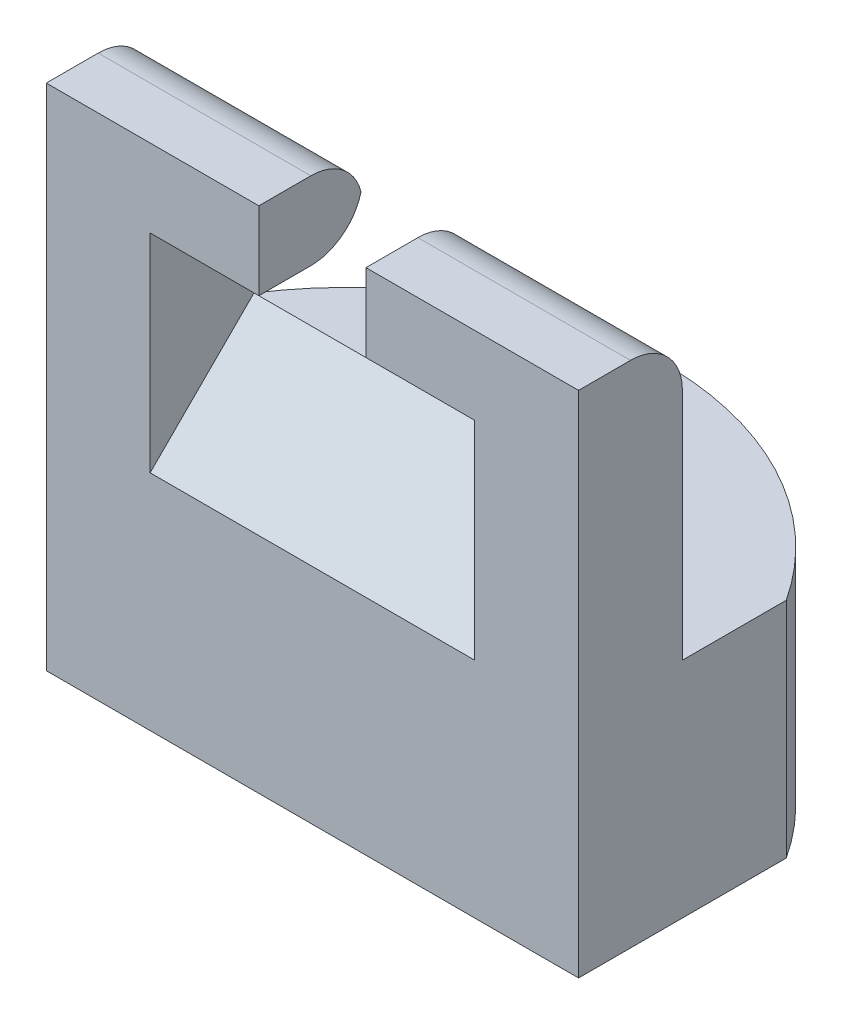
ISO-10303-21;
HEADER;
FILE_DESCRIPTION(('STEP AP214'),'2;1');
FILE_NAME('part.step','',(''),(''),'','','');
FILE_SCHEMA(('AUTOMOTIVE_DESIGN { 1 0 10303 214 1 1 1 1 }'));
ENDSEC;
DATA;
#1=APPLICATION_CONTEXT('core data for automotive mechanical design processes');
#2=APPLICATION_PROTOCOL_DEFINITION('international standard','automotive_design',2000,#1);
#3=PRODUCT_CONTEXT('',#1,'mechanical');
#4=PRODUCT('Part','Part','',(#3));
#5=PRODUCT_RELATED_PRODUCT_CATEGORY('part','',(#4));
#6=PRODUCT_DEFINITION_FORMATION('','',#4);
#7=PRODUCT_DEFINITION_CONTEXT('part definition',#1,'design');
#8=PRODUCT_DEFINITION('design','',#6,#7);
#9=PRODUCT_DEFINITION_SHAPE('','',#8);
#10=(LENGTH_UNIT() NAMED_UNIT(*) SI_UNIT(.MILLI.,.METRE.));
#11=(NAMED_UNIT(*) PLANE_ANGLE_UNIT() SI_UNIT($,.RADIAN.));
#12=(NAMED_UNIT(*) SI_UNIT($,.STERADIAN.) SOLID_ANGLE_UNIT());
#13=UNCERTAINTY_MEASURE_WITH_UNIT(LENGTH_MEASURE(1.E-05),#10,'distance_accuracy_value','');
#14=(GEOMETRIC_REPRESENTATION_CONTEXT(3) GLOBAL_UNCERTAINTY_ASSIGNED_CONTEXT((#13)) GLOBAL_UNIT_ASSIGNED_CONTEXT((#10,
#11,#12)) REPRESENTATION_CONTEXT('',''));
#15=CARTESIAN_POINT('',(0.,0.,0.));
#16=DIRECTION('',(0.,0.,1.));
#17=DIRECTION('',(1.,0.,0.));
#18=AXIS2_PLACEMENT_3D('',#15,#16,#17);
#19=CARTESIAN_POINT('',(0.,9.8,0.));
#20=DIRECTION('',(0.,1.,0.));
#21=DIRECTION('',(0.,0.,1.));
#22=AXIS2_PLACEMENT_3D('',#19,#20,#21);
#23=PLANE('',#22);
#24=DIRECTION('',(0.,0.,1.));
#25=VECTOR('',#24,1.);
#26=CARTESIAN_POINT('',(4.09375,9.8,-2.));
#27=LINE('',#26,#25);
#28=CARTESIAN_POINT('',(4.09375,9.8,-1.));
#29=VERTEX_POINT('',#28);
#30=CARTESIAN_POINT('',(4.09375,9.8,0.));
#31=VERTEX_POINT('',#30);
#32=EDGE_CURVE('E173',#29,#31,#27,.T.);
#33=ORIENTED_EDGE('',*,*,#32,.F.);
#34=DIRECTION('',(-1.,0.,0.));
#35=VECTOR('',#34,1.);
#36=CARTESIAN_POINT('',(0.,9.8,-1.));
#37=LINE('',#36,#35);
#38=CARTESIAN_POINT('',(0.,9.8,-1.));
#39=VERTEX_POINT('',#38);
#40=EDGE_CURVE('E272',#29,#39,#37,.T.);
#41=ORIENTED_EDGE('',*,*,#40,.T.);
#42=DIRECTION('',(0.,0.,1.));
#43=VECTOR('',#42,1.);
#44=CARTESIAN_POINT('',(0.,9.8,0.));
#45=LINE('',#44,#43);
#46=CARTESIAN_POINT('',(0.,9.8,0.));
#47=VERTEX_POINT('',#46);
#48=EDGE_CURVE('E208',#39,#47,#45,.T.);
#49=ORIENTED_EDGE('',*,*,#48,.T.);
#50=DIRECTION('',(1.,0.,0.));
#51=VECTOR('',#50,1.);
#52=CARTESIAN_POINT('',(0.,9.8,0.));
#53=LINE('',#52,#51);
#54=EDGE_CURVE('E211',#47,#31,#53,.T.);
#55=ORIENTED_EDGE('',*,*,#54,.T.);
#56=EDGE_LOOP('',(#33,#41,#49,#55));
#57=FACE_BOUND('',#56,.T.);
#58=ADVANCED_FACE('F41',(#57),#23,.T.);
#59=CARTESIAN_POINT('',(2.,8.3,-6.77089803375032));
#60=DIRECTION('',(0.,1.,0.));
#61=DIRECTION('',(0.,0.,1.));
#62=AXIS2_PLACEMENT_3D('',#59,#60,#61);
#63=PLANE('',#62);
#64=DIRECTION('',(-1.,0.,0.));
#65=VECTOR('',#64,1.);
#66=CARTESIAN_POINT('',(2.,8.3,-1.));
#67=LINE('',#66,#65);
#68=CARTESIAN_POINT('',(2.,8.3,-1.));
#69=VERTEX_POINT('',#68);
#70=CARTESIAN_POINT('',(4.09375,8.3,-1.));
#71=VERTEX_POINT('',#70);
#72=EDGE_CURVE('E187',#69,#71,#67,.F.);
#73=ORIENTED_EDGE('',*,*,#72,.T.);
#74=DIRECTION('',(0.,0.,-1.));
#75=VECTOR('',#74,1.);
#76=CARTESIAN_POINT('',(4.09375,8.3,-2.));
#77=LINE('',#76,#75);
#78=CARTESIAN_POINT('',(4.09375,8.3,0.));
#79=VERTEX_POINT('',#78);
#80=EDGE_CURVE('E170',#79,#71,#77,.T.);
#81=ORIENTED_EDGE('',*,*,#80,.F.);
#82=DIRECTION('',(-1.,0.,0.));
#83=VECTOR('',#82,1.);
#84=CARTESIAN_POINT('',(2.,8.3,0.));
#85=LINE('',#84,#83);
#86=CARTESIAN_POINT('',(2.,8.3,0.));
#87=VERTEX_POINT('',#86);
#88=EDGE_CURVE('E184',#79,#87,#85,.T.);
#89=ORIENTED_EDGE('',*,*,#88,.T.);
#90=DIRECTION('',(0.,0.,1.));
#91=VECTOR('',#90,1.);
#92=CARTESIAN_POINT('',(2.,8.3,-6.77089803375032));
#93=LINE('',#92,#91);
#94=EDGE_CURVE('E204',#69,#87,#93,.T.);
#95=ORIENTED_EDGE('',*,*,#94,.F.);
#96=EDGE_LOOP('',(#73,#81,#89,#95));
#97=FACE_BOUND('',#96,.T.);
#98=ADVANCED_FACE('F182',(#97),#63,.F.);
#99=CARTESIAN_POINT('',(0.,9.3,-1.));
#100=DIRECTION('',(-1.,0.,0.));
#101=DIRECTION('',(0.,0.,1.));
#102=AXIS2_PLACEMENT_3D('',#99,#100,#101);
#103=CYLINDRICAL_SURFACE('',#102,1.);
#104=CARTESIAN_POINT('',(2.,9.3,-1.));
#105=DIRECTION('',(-1.,0.,0.));
#106=DIRECTION('',(0.,-1.,0.));
#107=AXIS2_PLACEMENT_3D('',#104,#105,#106);
#108=CIRCLE('',#107,1.);
#109=CARTESIAN_POINT('',(2.,9.05,-1.96824583655186));
#110=VERTEX_POINT('',#109);
#111=EDGE_CURVE('E260',#110,#69,#108,.T.);
#112=ORIENTED_EDGE('',*,*,#111,.F.);
#113=DIRECTION('',(1.,0.,0.));
#114=VECTOR('',#113,1.);
#115=CARTESIAN_POINT('',(2.,9.05,-1.96824583655186));
#116=LINE('',#115,#114);
#117=CARTESIAN_POINT('',(4.09375,9.05,-1.96824583655186));
#118=VERTEX_POINT('',#117);
#119=EDGE_CURVE('E283',#110,#118,#116,.T.);
#120=ORIENTED_EDGE('',*,*,#119,.T.);
#121=CARTESIAN_POINT('',(4.09375,9.3,-1.));
#122=DIRECTION('',(-1.,0.,0.));
#123=DIRECTION('',(0.,0.,1.));
#124=AXIS2_PLACEMENT_3D('',#121,#122,#123);
#125=CIRCLE('',#124,1.);
#126=EDGE_CURVE('E188',#118,#71,#125,.T.);
#127=ORIENTED_EDGE('',*,*,#126,.T.);
#128=ORIENTED_EDGE('',*,*,#72,.F.);
#129=EDGE_LOOP('',(#112,#120,#127,#128));
#130=FACE_BOUND('',#129,.T.);
#131=ADVANCED_FACE('F344',(#130),#103,.T.);
#132=CARTESIAN_POINT('',(5.125,4.3,-0.645898033750316));
#133=DIRECTION('',(0.,-1.,0.));
#134=DIRECTION('',(0.,0.,-1.));
#135=AXIS2_PLACEMENT_3D('',#132,#133,#134);
#136=PLANE('',#135);
#137=DIRECTION('',(-1.,0.,0.));
#138=VECTOR('',#137,1.);
#139=CARTESIAN_POINT('',(0.,4.3,-2.));
#140=LINE('',#139,#138);
#141=CARTESIAN_POINT('',(10.25,4.3,-2.));
#142=VERTEX_POINT('',#141);
#143=CARTESIAN_POINT('',(0.,4.3,-2.));
#144=VERTEX_POINT('',#143);
#145=EDGE_CURVE('E206',#142,#144,#140,.T.);
#146=ORIENTED_EDGE('',*,*,#145,.F.);
#147=DIRECTION('',(0.,0.,-1.));
#148=VECTOR('',#147,1.);
#149=CARTESIAN_POINT('',(10.25,4.3,-4.));
#150=LINE('',#149,#148);
#151=CARTESIAN_POINT('',(10.25,4.3,-3.99999999999999));
#152=VERTEX_POINT('',#151);
#153=EDGE_CURVE('E223',#142,#152,#150,.T.);
#154=ORIENTED_EDGE('',*,*,#153,.T.);
#155=CARTESIAN_POINT('',(5.125,4.3,-0.645898033750316));
#156=DIRECTION('',(0.,1.,0.));
#157=DIRECTION('',(0.,0.,-1.));
#158=AXIS2_PLACEMENT_3D('',#155,#156,#157);
#159=CIRCLE('',#158,6.125);
#160=CARTESIAN_POINT('',(0.,4.3,-4.));
#161=VERTEX_POINT('',#160);
#162=EDGE_CURVE('E225',#152,#161,#159,.T.);
#163=ORIENTED_EDGE('',*,*,#162,.T.);
#164=DIRECTION('',(0.,0.,1.));
#165=VECTOR('',#164,1.);
#166=CARTESIAN_POINT('',(0.,4.3,-4.));
#167=LINE('',#166,#165);
#168=EDGE_CURVE('E228',#161,#144,#167,.T.);
#169=ORIENTED_EDGE('',*,*,#168,.T.);
#170=EDGE_LOOP('',(#146,#154,#163,#169));
#171=FACE_BOUND('',#170,.T.);
#172=ADVANCED_FACE('F476',(#171),#136,.F.);
#173=CARTESIAN_POINT('',(0.,4.3,0.));
#174=DIRECTION('',(0.,0.,-1.));
#175=DIRECTION('',(-1.,0.,0.));
#176=AXIS2_PLACEMENT_3D('',#173,#174,#175);
#177=PLANE('',#176);
#178=DIRECTION('',(0.,1.,0.));
#179=VECTOR('',#178,1.);
#180=CARTESIAN_POINT('',(8.25000000000001,8.3,0.));
#181=LINE('',#180,#179);
#182=CARTESIAN_POINT('',(8.25000000000001,4.29999999999999,0.));
#183=VERTEX_POINT('',#182);
#184=CARTESIAN_POINT('',(8.25000000000001,8.3,0.));
#185=VERTEX_POINT('',#184);
#186=EDGE_CURVE('E196',#183,#185,#181,.T.);
#187=ORIENTED_EDGE('',*,*,#186,.F.);
#188=DIRECTION('',(-1.,0.,0.));
#189=VECTOR('',#188,1.);
#190=CARTESIAN_POINT('',(0.,4.29999999999999,0.));
#191=LINE('',#190,#189);
#192=CARTESIAN_POINT('',(2.,4.29999999999999,0.));
#193=VERTEX_POINT('',#192);
#194=EDGE_CURVE('E264',#183,#193,#191,.T.);
#195=ORIENTED_EDGE('',*,*,#194,.T.);
#196=DIRECTION('',(0.,-1.,0.));
#197=VECTOR('',#196,1.);
#198=CARTESIAN_POINT('',(2.,8.3,0.));
#199=LINE('',#198,#197);
#200=EDGE_CURVE('E194',#87,#193,#199,.T.);
#201=ORIENTED_EDGE('',*,*,#200,.F.);
#202=ORIENTED_EDGE('',*,*,#88,.F.);
#203=DIRECTION('',(0.,1.,0.));
#204=VECTOR('',#203,1.);
#205=CARTESIAN_POINT('',(4.09375,-0.000999999999999265,0.));
#206=LINE('',#205,#204);
#207=EDGE_CURVE('E166',#79,#31,#206,.T.);
#208=ORIENTED_EDGE('',*,*,#207,.T.);
#209=ORIENTED_EDGE('',*,*,#54,.F.);
#210=DIRECTION('',(0.,-1.,0.));
#211=VECTOR('',#210,1.);
#212=CARTESIAN_POINT('',(0.,4.3,0.));
#213=LINE('',#212,#211);
#214=CARTESIAN_POINT('',(0.,0.,0.));
#215=VERTEX_POINT('',#214);
#216=EDGE_CURVE('E231',#47,#215,#213,.T.);
#217=ORIENTED_EDGE('',*,*,#216,.T.);
#218=DIRECTION('',(1.,0.,0.));
#219=VECTOR('',#218,1.);
#220=CARTESIAN_POINT('',(0.,0.,0.));
#221=LINE('',#220,#219);
#222=CARTESIAN_POINT('',(10.25,0.,0.));
#223=VERTEX_POINT('',#222);
#224=EDGE_CURVE('E222',#215,#223,#221,.T.);
#225=ORIENTED_EDGE('',*,*,#224,.T.);
#226=DIRECTION('',(0.,-1.,0.));
#227=VECTOR('',#226,1.);
#228=CARTESIAN_POINT('',(10.25,4.3,0.));
#229=LINE('',#228,#227);
#230=CARTESIAN_POINT('',(10.25,9.8,0.));
#231=VERTEX_POINT('',#230);
#232=EDGE_CURVE('E247',#231,#223,#229,.T.);
#233=ORIENTED_EDGE('',*,*,#232,.F.);
#234=CARTESIAN_POINT('',(6.15625,9.8,0.));
#235=VERTEX_POINT('',#234);
#236=EDGE_CURVE('E210',#235,#231,#53,.T.);
#237=ORIENTED_EDGE('',*,*,#236,.F.);
#238=DIRECTION('',(0.,1.,0.));
#239=VECTOR('',#238,1.);
#240=CARTESIAN_POINT('',(6.15625,-0.000999999999999265,0.));
#241=LINE('',#240,#239);
#242=CARTESIAN_POINT('',(6.15625,8.3,0.));
#243=VERTEX_POINT('',#242);
#244=EDGE_CURVE('E178',#243,#235,#241,.T.);
#245=ORIENTED_EDGE('',*,*,#244,.F.);
#246=EDGE_CURVE('E195',#185,#243,#85,.T.);
#247=ORIENTED_EDGE('',*,*,#246,.F.);
#248=EDGE_LOOP('',(#187,#195,#201,#202,#208,#209,#217,#225,#233,#237,#245,#247));
#249=FACE_BOUND('',#248,.T.);
#250=ADVANCED_FACE('F192',(#249),#177,.F.);
#251=CARTESIAN_POINT('',(10.25,4.3,-4.));
#252=DIRECTION('',(-1.,0.,0.));
#253=DIRECTION('',(0.,0.,1.));
#254=AXIS2_PLACEMENT_3D('',#251,#252,#253);
#255=PLANE('',#254);
#256=DIRECTION('',(0.,-1.,0.));
#257=VECTOR('',#256,1.);
#258=CARTESIAN_POINT('',(10.25,9.8,-2.));
#259=LINE('',#258,#257);
#260=CARTESIAN_POINT('',(10.25,8.8,-2.));
#261=VERTEX_POINT('',#260);
#262=EDGE_CURVE('E216',#261,#142,#259,.T.);
#263=ORIENTED_EDGE('',*,*,#262,.F.);
#264=CARTESIAN_POINT('',(10.25,8.8,-1.));
#265=DIRECTION('',(-1.,0.,0.));
#266=DIRECTION('',(0.,0.,1.));
#267=AXIS2_PLACEMENT_3D('',#264,#265,#266);
#268=CIRCLE('',#267,1.);
#269=CARTESIAN_POINT('',(10.25,9.8,-1.));
#270=VERTEX_POINT('',#269);
#271=EDGE_CURVE('E11',#261,#270,#268,.F.);
#272=ORIENTED_EDGE('',*,*,#271,.T.);
#273=DIRECTION('',(0.,0.,-1.));
#274=VECTOR('',#273,1.);
#275=CARTESIAN_POINT('',(10.25,9.8,0.));
#276=LINE('',#275,#274);
#277=EDGE_CURVE('E213',#231,#270,#276,.T.);
#278=ORIENTED_EDGE('',*,*,#277,.F.);
#279=ORIENTED_EDGE('',*,*,#232,.T.);
#280=DIRECTION('',(0.,0.,-1.));
#281=VECTOR('',#280,1.);
#282=CARTESIAN_POINT('',(10.25,0.,-4.));
#283=LINE('',#282,#281);
#284=CARTESIAN_POINT('',(10.25,0.,-3.99999999999999));
#285=VERTEX_POINT('',#284);
#286=EDGE_CURVE('E234',#223,#285,#283,.T.);
#287=ORIENTED_EDGE('',*,*,#286,.T.);
#288=DIRECTION('',(0.,-1.,0.));
#289=VECTOR('',#288,1.);
#290=CARTESIAN_POINT('',(10.25,4.3,-3.99999999999999));
#291=LINE('',#290,#289);
#292=EDGE_CURVE('E244',#152,#285,#291,.T.);
#293=ORIENTED_EDGE('',*,*,#292,.F.);
#294=ORIENTED_EDGE('',*,*,#153,.F.);
#295=EDGE_LOOP('',(#263,#272,#278,#279,#287,#293,#294));
#296=FACE_BOUND('',#295,.T.);
#297=ADVANCED_FACE('F307',(#296),#255,.F.);
#298=CARTESIAN_POINT('',(5.125,4.3,-0.645898033750316));
#299=DIRECTION('',(0.,-1.,0.));
#300=DIRECTION('',(0.,0.,-1.));
#301=AXIS2_PLACEMENT_3D('',#298,#299,#300);
#302=CYLINDRICAL_SURFACE('',#301,6.125);
#303=CARTESIAN_POINT('',(5.125,0.,-0.645898033750316));
#304=DIRECTION('',(0.,1.,0.));
#305=DIRECTION('',(0.,0.,-1.));
#306=AXIS2_PLACEMENT_3D('',#303,#304,#305);
#307=CIRCLE('',#306,6.125);
#308=CARTESIAN_POINT('',(0.,0.,-4.));
#309=VERTEX_POINT('',#308);
#310=EDGE_CURVE('E236',#285,#309,#307,.T.);
#311=ORIENTED_EDGE('',*,*,#310,.T.);
#312=DIRECTION('',(0.,-1.,0.));
#313=VECTOR('',#312,1.);
#314=CARTESIAN_POINT('',(0.,4.3,-4.));
#315=LINE('',#314,#313);
#316=EDGE_CURVE('E241',#161,#309,#315,.T.);
#317=ORIENTED_EDGE('',*,*,#316,.F.);
#318=ORIENTED_EDGE('',*,*,#162,.F.);
#319=ORIENTED_EDGE('',*,*,#292,.T.);
#320=EDGE_LOOP('',(#311,#317,#318,#319));
#321=FACE_BOUND('',#320,.T.);
#322=ADVANCED_FACE('F321',(#321),#302,.T.);
#323=CARTESIAN_POINT('',(0.,4.3,-4.));
#324=DIRECTION('',(1.,0.,0.));
#325=DIRECTION('',(0.,0.,-1.));
#326=AXIS2_PLACEMENT_3D('',#323,#324,#325);
#327=PLANE('',#326);
#328=ORIENTED_EDGE('',*,*,#48,.F.);
#329=CARTESIAN_POINT('',(0.,8.8,-1.));
#330=DIRECTION('',(1.,0.,0.));
#331=DIRECTION('',(0.,0.,-1.));
#332=AXIS2_PLACEMENT_3D('',#329,#330,#331);
#333=CIRCLE('',#332,1.);
#334=CARTESIAN_POINT('',(0.,8.8,-2.));
#335=VERTEX_POINT('',#334);
#336=EDGE_CURVE('E275',#39,#335,#333,.F.);
#337=ORIENTED_EDGE('',*,*,#336,.T.);
#338=DIRECTION('',(0.,-1.,0.));
#339=VECTOR('',#338,1.);
#340=CARTESIAN_POINT('',(0.,9.8,-2.));
#341=LINE('',#340,#339);
#342=EDGE_CURVE('E220',#335,#144,#341,.T.);
#343=ORIENTED_EDGE('',*,*,#342,.T.);
#344=ORIENTED_EDGE('',*,*,#168,.F.);
#345=ORIENTED_EDGE('',*,*,#316,.T.);
#346=DIRECTION('',(0.,0.,1.));
#347=VECTOR('',#346,1.);
#348=CARTESIAN_POINT('',(0.,0.,-4.));
#349=LINE('',#348,#347);
#350=EDGE_CURVE('E226',#309,#215,#349,.T.);
#351=ORIENTED_EDGE('',*,*,#350,.T.);
#352=ORIENTED_EDGE('',*,*,#216,.F.);
#353=EDGE_LOOP('',(#328,#337,#343,#344,#345,#351,#352));
#354=FACE_BOUND('',#353,.T.);
#355=ADVANCED_FACE('F328',(#354),#327,.F.);
#356=CARTESIAN_POINT('',(5.125,0.,-0.645898033750316));
#357=DIRECTION('',(0.,-1.,0.));
#358=DIRECTION('',(0.,0.,-1.));
#359=AXIS2_PLACEMENT_3D('',#356,#357,#358);
#360=PLANE('',#359);
#361=CARTESIAN_POINT('',(5.125,0.,-4.));
#362=DIRECTION('',(0.,-1.,0.));
#363=DIRECTION('',(0.,0.,-1.));
#364=AXIS2_PLACEMENT_3D('',#361,#362,#363);
#365=CIRCLE('',#364,2.05);
#366=CARTESIAN_POINT('',(5.125,0.,-6.05));
#367=VERTEX_POINT('',#366);
#368=EDGE_CURVE('E365',#367,#367,#365,.T.);
#369=ORIENTED_EDGE('',*,*,#368,.F.);
#370=EDGE_LOOP('',(#369));
#371=FACE_BOUND('',#370,.T.);
#372=ORIENTED_EDGE('',*,*,#224,.F.);
#373=ORIENTED_EDGE('',*,*,#350,.F.);
#374=ORIENTED_EDGE('',*,*,#310,.F.);
#375=ORIENTED_EDGE('',*,*,#286,.F.);
#376=EDGE_LOOP('',(#372,#373,#374,#375));
#377=FACE_BOUND('',#376,.T.);
#378=ADVANCED_FACE('F324',(#371,#377),#360,.T.);
#379=CARTESIAN_POINT('',(0.,9.8,-2.));
#380=DIRECTION('',(0.,0.,1.));
#381=DIRECTION('',(1.,0.,0.));
#382=AXIS2_PLACEMENT_3D('',#379,#380,#381);
#383=PLANE('',#382);
#384=ORIENTED_EDGE('',*,*,#342,.F.);
#385=DIRECTION('',(-1.,0.,0.));
#386=VECTOR('',#385,1.);
#387=CARTESIAN_POINT('',(4.09375,8.8,-2.));
#388=LINE('',#387,#386);
#389=CARTESIAN_POINT('',(2.,8.8,-2.));
#390=VERTEX_POINT('',#389);
#391=EDGE_CURVE('E279',#335,#390,#388,.F.);
#392=ORIENTED_EDGE('',*,*,#391,.T.);
#393=DIRECTION('',(0.,-1.,0.));
#394=VECTOR('',#393,1.);
#395=CARTESIAN_POINT('',(2.,9.8,-2.));
#396=LINE('',#395,#394);
#397=CARTESIAN_POINT('',(2.,6.3,-2.));
#398=VERTEX_POINT('',#397);
#399=EDGE_CURVE('E256',#390,#398,#396,.T.);
#400=ORIENTED_EDGE('',*,*,#399,.T.);
#401=DIRECTION('',(1.,0.,0.));
#402=VECTOR('',#401,1.);
#403=CARTESIAN_POINT('',(0.,6.3,-2.));
#404=LINE('',#403,#402);
#405=CARTESIAN_POINT('',(8.25000000000001,6.3,-2.));
#406=VERTEX_POINT('',#405);
#407=EDGE_CURVE('E250',#398,#406,#404,.T.);
#408=ORIENTED_EDGE('',*,*,#407,.T.);
#409=DIRECTION('',(0.,1.,0.));
#410=VECTOR('',#409,1.);
#411=CARTESIAN_POINT('',(8.25000000000001,9.8,-2.));
#412=LINE('',#411,#410);
#413=CARTESIAN_POINT('',(8.25000000000001,8.8,-2.));
#414=VERTEX_POINT('',#413);
#415=EDGE_CURVE('E253',#406,#414,#412,.T.);
#416=ORIENTED_EDGE('',*,*,#415,.T.);
#417=DIRECTION('',(-1.,0.,0.));
#418=VECTOR('',#417,1.);
#419=CARTESIAN_POINT('',(10.25,8.8,-2.));
#420=LINE('',#419,#418);
#421=EDGE_CURVE('E277',#414,#261,#420,.F.);
#422=ORIENTED_EDGE('',*,*,#421,.T.);
#423=ORIENTED_EDGE('',*,*,#262,.T.);
#424=ORIENTED_EDGE('',*,*,#145,.T.);
#425=EDGE_LOOP('',(#384,#392,#400,#408,#416,#422,#423,#424));
#426=FACE_BOUND('',#425,.T.);
#427=ADVANCED_FACE('F300',(#426),#383,.F.);
#428=ORIENTED_EDGE('',*,*,#277,.T.);
#429=DIRECTION('',(-1.,0.,0.));
#430=VECTOR('',#429,1.);
#431=CARTESIAN_POINT('',(6.15625,9.8,-1.));
#432=LINE('',#431,#430);
#433=CARTESIAN_POINT('',(6.15625,9.8,-1.));
#434=VERTEX_POINT('',#433);
#435=EDGE_CURVE('E287',#270,#434,#432,.T.);
#436=ORIENTED_EDGE('',*,*,#435,.T.);
#437=DIRECTION('',(0.,0.,-1.));
#438=VECTOR('',#437,1.);
#439=CARTESIAN_POINT('',(6.15625,9.8,-2.));
#440=LINE('',#439,#438);
#441=EDGE_CURVE('E179',#235,#434,#440,.T.);
#442=ORIENTED_EDGE('',*,*,#441,.F.);
#443=ORIENTED_EDGE('',*,*,#236,.T.);
#444=EDGE_LOOP('',(#428,#436,#442,#443));
#445=FACE_BOUND('',#444,.T.);
#446=ADVANCED_FACE('F310',(#445),#23,.T.);
#447=CARTESIAN_POINT('',(2.,8.3,-6.77089803375032));
#448=DIRECTION('',(-1.,0.,0.));
#449=DIRECTION('',(0.,-1.,0.));
#450=AXIS2_PLACEMENT_3D('',#447,#448,#449);
#451=PLANE('',#450);
#452=ORIENTED_EDGE('',*,*,#399,.F.);
#453=CARTESIAN_POINT('',(2.,8.8,-1.));
#454=DIRECTION('',(-1.,0.,0.));
#455=DIRECTION('',(0.,-1.,0.));
#456=AXIS2_PLACEMENT_3D('',#453,#454,#455);
#457=CIRCLE('',#456,1.);
#458=EDGE_CURVE('E281',#390,#110,#457,.F.);
#459=ORIENTED_EDGE('',*,*,#458,.T.);
#460=ORIENTED_EDGE('',*,*,#111,.T.);
#461=ORIENTED_EDGE('',*,*,#94,.T.);
#462=ORIENTED_EDGE('',*,*,#200,.T.);
#463=DIRECTION('',(0.,-0.707106781186549,0.707106781186546));
#464=VECTOR('',#463,1.);
#465=CARTESIAN_POINT('',(2.,9.68544901687516,-5.38544901687515));
#466=LINE('',#465,#464);
#467=EDGE_CURVE('E269',#193,#398,#466,.F.);
#468=ORIENTED_EDGE('',*,*,#467,.T.);
#469=EDGE_LOOP('',(#452,#459,#460,#461,#462,#468));
#470=FACE_BOUND('',#469,.T.);
#471=ADVANCED_FACE('F342',(#470),#451,.F.);
#472=ORIENTED_EDGE('',*,*,#246,.T.);
#473=DIRECTION('',(0.,0.,1.));
#474=VECTOR('',#473,1.);
#475=CARTESIAN_POINT('',(6.15625,8.3,-2.));
#476=LINE('',#475,#474);
#477=CARTESIAN_POINT('',(6.15625,8.3,-1.));
#478=VERTEX_POINT('',#477);
#479=EDGE_CURVE('E189',#478,#243,#476,.T.);
#480=ORIENTED_EDGE('',*,*,#479,.F.);
#481=CARTESIAN_POINT('',(8.25000000000001,8.3,-1.));
#482=VERTEX_POINT('',#481);
#483=EDGE_CURVE('E258',#478,#482,#67,.F.);
#484=ORIENTED_EDGE('',*,*,#483,.T.);
#485=DIRECTION('',(0.,0.,1.));
#486=VECTOR('',#485,1.);
#487=CARTESIAN_POINT('',(8.25000000000001,8.3,-6.77089803375032));
#488=LINE('',#487,#486);
#489=EDGE_CURVE('E199',#482,#185,#488,.T.);
#490=ORIENTED_EDGE('',*,*,#489,.T.);
#491=EDGE_LOOP('',(#472,#480,#484,#490));
#492=FACE_BOUND('',#491,.T.);
#493=ADVANCED_FACE('F359',(#492),#63,.F.);
#494=CARTESIAN_POINT('',(8.25000000000001,8.3,-6.77089803375032));
#495=DIRECTION('',(1.,0.,0.));
#496=DIRECTION('',(0.,0.,-1.));
#497=AXIS2_PLACEMENT_3D('',#494,#495,#496);
#498=PLANE('',#497);
#499=CARTESIAN_POINT('',(8.25000000000001,9.3,-1.));
#500=DIRECTION('',(1.,0.,0.));
#501=DIRECTION('',(0.,0.,-1.));
#502=AXIS2_PLACEMENT_3D('',#499,#500,#501);
#503=CIRCLE('',#502,1.);
#504=CARTESIAN_POINT('',(8.25000000000001,9.05,-1.96824583655186));
#505=VERTEX_POINT('',#504);
#506=EDGE_CURVE('E262',#482,#505,#503,.T.);
#507=ORIENTED_EDGE('',*,*,#506,.T.);
#508=CARTESIAN_POINT('',(8.25000000000001,8.8,-1.));
#509=DIRECTION('',(1.,0.,0.));
#510=DIRECTION('',(0.,0.,-1.));
#511=AXIS2_PLACEMENT_3D('',#508,#509,#510);
#512=CIRCLE('',#511,1.);
#513=EDGE_CURVE('E49',#505,#414,#512,.F.);
#514=ORIENTED_EDGE('',*,*,#513,.T.);
#515=ORIENTED_EDGE('',*,*,#415,.F.);
#516=DIRECTION('',(0.,0.707106781186549,-0.707106781186546));
#517=VECTOR('',#516,1.);
#518=CARTESIAN_POINT('',(8.25000000000001,9.68544901687516,-5.38544901687515));
#519=LINE('',#518,#517);
#520=EDGE_CURVE('E266',#406,#183,#519,.F.);
#521=ORIENTED_EDGE('',*,*,#520,.T.);
#522=ORIENTED_EDGE('',*,*,#186,.T.);
#523=ORIENTED_EDGE('',*,*,#489,.F.);
#524=EDGE_LOOP('',(#507,#514,#515,#521,#522,#523));
#525=FACE_BOUND('',#524,.T.);
#526=ADVANCED_FACE('F294',(#525),#498,.F.);
#527=CARTESIAN_POINT('',(6.15625,9.3,-1.));
#528=DIRECTION('',(1.,0.,0.));
#529=DIRECTION('',(0.,0.,-1.));
#530=AXIS2_PLACEMENT_3D('',#527,#528,#529);
#531=CIRCLE('',#530,1.);
#532=CARTESIAN_POINT('',(6.15625,9.05,-1.96824583655186));
#533=VERTEX_POINT('',#532);
#534=EDGE_CURVE('E350',#478,#533,#531,.T.);
#535=ORIENTED_EDGE('',*,*,#534,.T.);
#536=DIRECTION('',(1.,0.,0.));
#537=VECTOR('',#536,1.);
#538=CARTESIAN_POINT('',(6.15625,9.05,-1.96824583655186));
#539=LINE('',#538,#537);
#540=EDGE_CURVE('E56',#533,#505,#539,.T.);
#541=ORIENTED_EDGE('',*,*,#540,.T.);
#542=ORIENTED_EDGE('',*,*,#506,.F.);
#543=ORIENTED_EDGE('',*,*,#483,.F.);
#544=EDGE_LOOP('',(#535,#541,#542,#543));
#545=FACE_BOUND('',#544,.T.);
#546=ADVANCED_FACE('F361',(#545),#103,.T.);
#547=CARTESIAN_POINT('',(6.15625,-0.000999999999999265,-2.));
#548=DIRECTION('',(1.,0.,0.));
#549=DIRECTION('',(0.,0.,-1.));
#550=AXIS2_PLACEMENT_3D('',#547,#548,#549);
#551=PLANE('',#550);
#552=ORIENTED_EDGE('',*,*,#441,.T.);
#553=CARTESIAN_POINT('',(6.15625,8.8,-1.));
#554=DIRECTION('',(1.,0.,0.));
#555=DIRECTION('',(0.,0.,-1.));
#556=AXIS2_PLACEMENT_3D('',#553,#554,#555);
#557=CIRCLE('',#556,1.);
#558=EDGE_CURVE('E64',#434,#533,#557,.F.);
#559=ORIENTED_EDGE('',*,*,#558,.T.);
#560=ORIENTED_EDGE('',*,*,#534,.F.);
#561=ORIENTED_EDGE('',*,*,#479,.T.);
#562=ORIENTED_EDGE('',*,*,#244,.T.);
#563=EDGE_LOOP('',(#552,#559,#560,#561,#562));
#564=FACE_BOUND('',#563,.T.);
#565=ADVANCED_FACE('F362',(#564),#551,.F.);
#566=CARTESIAN_POINT('',(4.09375,-0.000999999999999265,-2.));
#567=DIRECTION('',(-1.,0.,0.));
#568=DIRECTION('',(0.,0.,1.));
#569=AXIS2_PLACEMENT_3D('',#566,#567,#568);
#570=PLANE('',#569);
#571=ORIENTED_EDGE('',*,*,#126,.F.);
#572=CARTESIAN_POINT('',(4.09375,8.8,-1.));
#573=DIRECTION('',(-1.,0.,0.));
#574=DIRECTION('',(0.,0.,1.));
#575=AXIS2_PLACEMENT_3D('',#572,#573,#574);
#576=CIRCLE('',#575,1.);
#577=EDGE_CURVE('E285',#118,#29,#576,.F.);
#578=ORIENTED_EDGE('',*,*,#577,.T.);
#579=ORIENTED_EDGE('',*,*,#32,.T.);
#580=ORIENTED_EDGE('',*,*,#207,.F.);
#581=ORIENTED_EDGE('',*,*,#80,.T.);
#582=EDGE_LOOP('',(#571,#578,#579,#580,#581));
#583=FACE_BOUND('',#582,.T.);
#584=ADVANCED_FACE('F169',(#583),#570,.F.);
#585=CARTESIAN_POINT('',(2.,6.3,-2.));
#586=DIRECTION('',(0.,-0.707106781186546,-0.707106781186549));
#587=DIRECTION('',(1.,0.,0.));
#588=AXIS2_PLACEMENT_3D('',#585,#586,#587);
#589=PLANE('',#588);
#590=ORIENTED_EDGE('',*,*,#467,.F.);
#591=ORIENTED_EDGE('',*,*,#194,.F.);
#592=ORIENTED_EDGE('',*,*,#520,.F.);
#593=ORIENTED_EDGE('',*,*,#407,.F.);
#594=EDGE_LOOP('',(#590,#591,#592,#593));
#595=FACE_BOUND('',#594,.T.);
#596=ADVANCED_FACE('F356',(#595),#589,.F.);
#597=CARTESIAN_POINT('',(0.,8.8,-1.));
#598=DIRECTION('',(1.,0.,0.));
#599=DIRECTION('',(0.,0.,-1.));
#600=AXIS2_PLACEMENT_3D('',#597,#598,#599);
#601=CYLINDRICAL_SURFACE('',#600,1.);
#602=ORIENTED_EDGE('',*,*,#458,.F.);
#603=ORIENTED_EDGE('',*,*,#391,.F.);
#604=ORIENTED_EDGE('',*,*,#336,.F.);
#605=ORIENTED_EDGE('',*,*,#40,.F.);
#606=ORIENTED_EDGE('',*,*,#577,.F.);
#607=ORIENTED_EDGE('',*,*,#119,.F.);
#608=EDGE_LOOP('',(#602,#603,#604,#605,#606,#607));
#609=FACE_BOUND('',#608,.T.);
#610=ADVANCED_FACE('F337',(#609),#601,.T.);
#611=CARTESIAN_POINT('',(0.,8.8,-1.));
#612=DIRECTION('',(1.,0.,0.));
#613=DIRECTION('',(0.,0.,-1.));
#614=AXIS2_PLACEMENT_3D('',#611,#612,#613);
#615=CYLINDRICAL_SURFACE('',#614,1.);
#616=ORIENTED_EDGE('',*,*,#271,.F.);
#617=ORIENTED_EDGE('',*,*,#421,.F.);
#618=ORIENTED_EDGE('',*,*,#513,.F.);
#619=ORIENTED_EDGE('',*,*,#540,.F.);
#620=ORIENTED_EDGE('',*,*,#558,.F.);
#621=ORIENTED_EDGE('',*,*,#435,.F.);
#622=EDGE_LOOP('',(#616,#617,#618,#619,#620,#621));
#623=FACE_BOUND('',#622,.T.);
#624=ADVANCED_FACE('F43',(#623),#615,.T.);
#625=CARTESIAN_POINT('',(5.125,4.1,-4.));
#626=DIRECTION('',(0.,-1.,0.));
#627=DIRECTION('',(0.,0.,-1.));
#628=AXIS2_PLACEMENT_3D('',#625,#626,#627);
#629=CYLINDRICAL_SURFACE('',#628,2.05);
#630=CARTESIAN_POINT('',(5.125,4.1,-4.));
#631=DIRECTION('',(0.,-1.,0.));
#632=DIRECTION('',(0.,0.,-1.));
#633=AXIS2_PLACEMENT_3D('',#630,#631,#632);
#634=CIRCLE('',#633,2.05);
#635=CARTESIAN_POINT('',(5.125,4.1,-6.05));
#636=VERTEX_POINT('',#635);
#637=EDGE_CURVE('E363',#636,#636,#634,.T.);
#638=ORIENTED_EDGE('',*,*,#637,.F.);
#639=EDGE_LOOP('',(#638));
#640=FACE_BOUND('',#639,.T.);
#641=ORIENTED_EDGE('',*,*,#368,.T.);
#642=EDGE_LOOP('',(#641));
#643=FACE_BOUND('',#642,.T.);
#644=ADVANCED_FACE('F371',(#640,#643),#629,.F.);
#645=CARTESIAN_POINT('',(5.125,4.1,-4.));
#646=DIRECTION('',(0.,-1.,0.));
#647=DIRECTION('',(0.,0.,-1.));
#648=AXIS2_PLACEMENT_3D('',#645,#646,#647);
#649=PLANE('',#648);
#650=ORIENTED_EDGE('',*,*,#637,.T.);
#651=EDGE_LOOP('',(#650));
#652=FACE_BOUND('',#651,.T.);
#653=ADVANCED_FACE('F408',(#652),#649,.T.);
#654=CLOSED_SHELL('',(#58,#98,#131,#172,#250,#297,#322,#355,#378,#427,#446,#471,#493,#526,#546,
#565,#584,#596,#610,#624,#644,#653));
#655=MANIFOLD_SOLID_BREP('B2',#654);
#656=ADVANCED_BREP_SHAPE_REPRESENTATION('',(#18,#655),#14);
#657=SHAPE_DEFINITION_REPRESENTATION(#9,#656);
ENDSEC;
END-ISO-10303-21;
